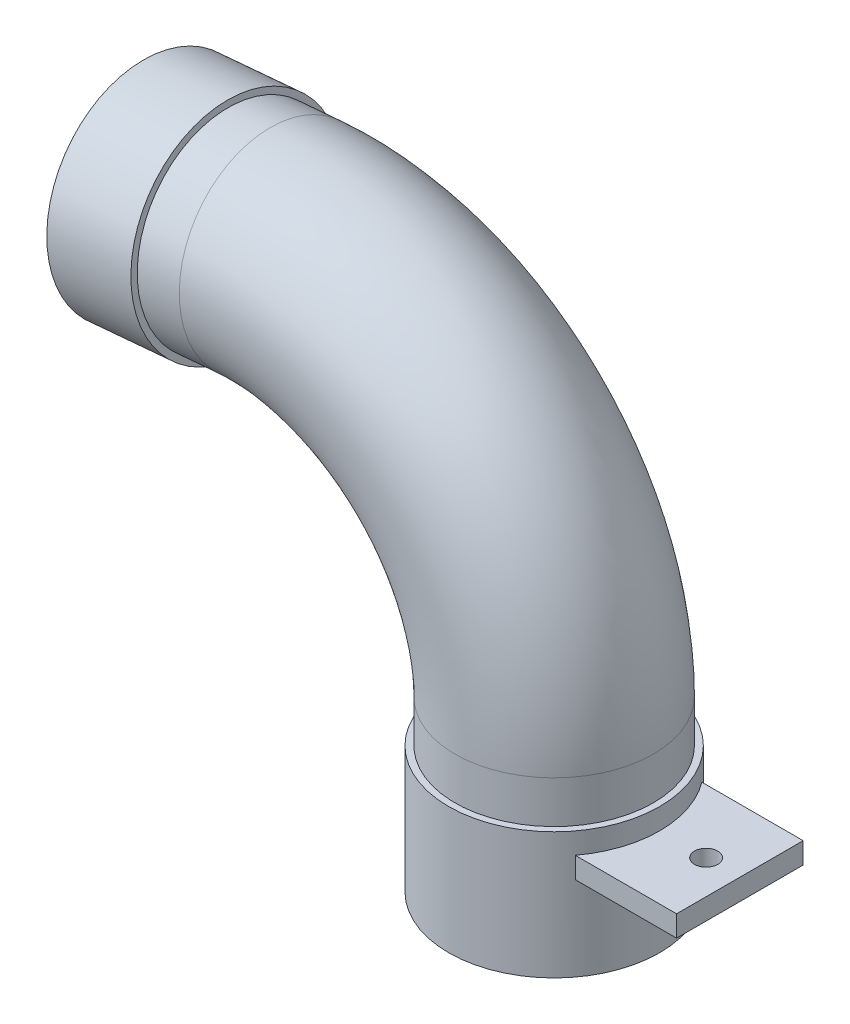
ISO-10303-21;
HEADER;
FILE_DESCRIPTION(('STEP AP214'),'2;1');
FILE_NAME('part.step','',(''),(''),'','','');
FILE_SCHEMA(('AUTOMOTIVE_DESIGN { 1 0 10303 214 1 1 1 1 }'));
ENDSEC;
DATA;
#1=APPLICATION_CONTEXT('core data for automotive mechanical design processes');
#2=APPLICATION_PROTOCOL_DEFINITION('international standard','automotive_design',2000,#1);
#3=PRODUCT_CONTEXT('',#1,'mechanical');
#4=PRODUCT('Part','Part','',(#3));
#5=PRODUCT_RELATED_PRODUCT_CATEGORY('part','',(#4));
#6=PRODUCT_DEFINITION_FORMATION('','',#4);
#7=PRODUCT_DEFINITION_CONTEXT('part definition',#1,'design');
#8=PRODUCT_DEFINITION('design','',#6,#7);
#9=PRODUCT_DEFINITION_SHAPE('','',#8);
#10=(LENGTH_UNIT() NAMED_UNIT(*) SI_UNIT(.MILLI.,.METRE.));
#11=(NAMED_UNIT(*) PLANE_ANGLE_UNIT() SI_UNIT($,.RADIAN.));
#12=(NAMED_UNIT(*) SI_UNIT($,.STERADIAN.) SOLID_ANGLE_UNIT());
#13=UNCERTAINTY_MEASURE_WITH_UNIT(LENGTH_MEASURE(1.E-05),#10,'distance_accuracy_value','');
#14=(GEOMETRIC_REPRESENTATION_CONTEXT(3) GLOBAL_UNCERTAINTY_ASSIGNED_CONTEXT((#13)) GLOBAL_UNIT_ASSIGNED_CONTEXT((#10,
#11,#12)) REPRESENTATION_CONTEXT('',''));
#15=CARTESIAN_POINT('',(0.,0.,0.));
#16=DIRECTION('',(0.,0.,1.));
#17=DIRECTION('',(1.,0.,0.));
#18=AXIS2_PLACEMENT_3D('',#15,#16,#17);
#19=CARTESIAN_POINT('',(0.,10.,0.));
#20=DIRECTION('',(0.,-1.,0.));
#21=DIRECTION('',(0.,0.,-1.));
#22=AXIS2_PLACEMENT_3D('',#19,#20,#21);
#23=CYLINDRICAL_SURFACE('',#22,23.);
#24=CARTESIAN_POINT('',(0.,-20.,0.));
#25=DIRECTION('',(0.,-1.,0.));
#26=DIRECTION('',(0.,0.,-1.));
#27=AXIS2_PLACEMENT_3D('',#24,#25,#26);
#28=CIRCLE('',#27,23.);
#29=CARTESIAN_POINT('',(0.,-20.,-23.));
#30=VERTEX_POINT('',#29);
#31=EDGE_CURVE('E129',#30,#30,#28,.T.);
#32=ORIENTED_EDGE('',*,*,#31,.T.);
#33=EDGE_LOOP('',(#32));
#34=FACE_BOUND('',#33,.T.);
#35=CARTESIAN_POINT('',(0.,0.,0.));
#36=DIRECTION('',(0.,1.,0.));
#37=DIRECTION('',(0.,0.,1.));
#38=AXIS2_PLACEMENT_3D('',#35,#36,#37);
#39=CIRCLE('',#38,23.);
#40=CARTESIAN_POINT('',(0.,0.,23.));
#41=VERTEX_POINT('',#40);
#42=EDGE_CURVE('E11',#41,#41,#39,.F.);
#43=ORIENTED_EDGE('',*,*,#42,.F.);
#44=EDGE_LOOP('',(#43));
#45=FACE_BOUND('',#44,.T.);
#46=ADVANCED_FACE('F39',(#34,#45),#23,.F.);
#47=CARTESIAN_POINT('',(0.,10.,0.));
#48=DIRECTION('',(0.,-1.,0.));
#49=DIRECTION('',(0.,0.,-1.));
#50=AXIS2_PLACEMENT_3D('',#47,#48,#49);
#51=CYLINDRICAL_SURFACE('',#50,25.);
#52=CARTESIAN_POINT('',(0.,10.,0.));
#53=DIRECTION('',(0.,-1.,0.));
#54=DIRECTION('',(0.,0.,-1.));
#55=AXIS2_PLACEMENT_3D('',#52,#53,#54);
#56=CIRCLE('',#55,25.);
#57=CARTESIAN_POINT('',(0.,10.,-25.));
#58=VERTEX_POINT('',#57);
#59=EDGE_CURVE('E49',#58,#58,#56,.T.);
#60=ORIENTED_EDGE('',*,*,#59,.T.);
#61=EDGE_LOOP('',(#60));
#62=FACE_BOUND('',#61,.T.);
#63=CARTESIAN_POINT('',(0.,-20.,0.));
#64=DIRECTION('',(0.,-1.,0.));
#65=DIRECTION('',(0.,0.,-1.));
#66=AXIS2_PLACEMENT_3D('',#63,#64,#65);
#67=CIRCLE('',#66,25.);
#68=CARTESIAN_POINT('',(0.,-20.,-25.));
#69=VERTEX_POINT('',#68);
#70=EDGE_CURVE('E138',#69,#69,#67,.T.);
#71=ORIENTED_EDGE('',*,*,#70,.F.);
#72=EDGE_LOOP('',(#71));
#73=FACE_BOUND('',#72,.T.);
#74=DIRECTION('',(0.,-1.,0.));
#75=VECTOR('',#74,1.);
#76=CARTESIAN_POINT('',(20.,5.,15.));
#77=LINE('',#76,#75);
#78=CARTESIAN_POINT('',(20.,5.,15.));
#79=VERTEX_POINT('',#78);
#80=CARTESIAN_POINT('',(20.,0.,15.));
#81=VERTEX_POINT('',#80);
#82=EDGE_CURVE('E61',#79,#81,#77,.T.);
#83=ORIENTED_EDGE('',*,*,#82,.F.);
#84=CARTESIAN_POINT('',(0.,5.,0.));
#85=DIRECTION('',(0.,1.,0.));
#86=DIRECTION('',(0.,0.,-1.));
#87=AXIS2_PLACEMENT_3D('',#84,#85,#86);
#88=CIRCLE('',#87,25.);
#89=CARTESIAN_POINT('',(20.,5.,-15.));
#90=VERTEX_POINT('',#89);
#91=EDGE_CURVE('E56',#79,#90,#88,.T.);
#92=ORIENTED_EDGE('',*,*,#91,.T.);
#93=DIRECTION('',(0.,-1.,0.));
#94=VECTOR('',#93,1.);
#95=CARTESIAN_POINT('',(20.,5.,-15.));
#96=LINE('',#95,#94);
#97=CARTESIAN_POINT('',(20.,0.,-15.));
#98=VERTEX_POINT('',#97);
#99=EDGE_CURVE('E130',#90,#98,#96,.T.);
#100=ORIENTED_EDGE('',*,*,#99,.T.);
#101=CARTESIAN_POINT('',(0.,0.,0.));
#102=DIRECTION('',(0.,1.,0.));
#103=DIRECTION('',(0.,0.,-1.));
#104=AXIS2_PLACEMENT_3D('',#101,#102,#103);
#105=CIRCLE('',#104,25.);
#106=EDGE_CURVE('E108',#81,#98,#105,.T.);
#107=ORIENTED_EDGE('',*,*,#106,.F.);
#108=EDGE_LOOP('',(#83,#92,#100,#107));
#109=FACE_BOUND('',#108,.T.);
#110=ADVANCED_FACE('F41',(#62,#73,#109),#51,.T.);
#111=CARTESIAN_POINT('',(0.,10.,0.));
#112=DIRECTION('',(0.,-1.,0.));
#113=DIRECTION('',(0.,0.,-1.));
#114=AXIS2_PLACEMENT_3D('',#111,#112,#113);
#115=PLANE('',#114);
#116=CARTESIAN_POINT('',(0.,10.,0.));
#117=DIRECTION('',(0.,-1.,0.));
#118=DIRECTION('',(0.,0.,-1.));
#119=AXIS2_PLACEMENT_3D('',#116,#117,#118);
#120=CIRCLE('',#119,23.5);
#121=CARTESIAN_POINT('',(0.,10.,-23.5));
#122=VERTEX_POINT('',#121);
#123=EDGE_CURVE('E43',#122,#122,#120,.T.);
#124=ORIENTED_EDGE('',*,*,#123,.T.);
#125=EDGE_LOOP('',(#124));
#126=FACE_BOUND('',#125,.T.);
#127=ORIENTED_EDGE('',*,*,#59,.F.);
#128=EDGE_LOOP('',(#127));
#129=FACE_BOUND('',#128,.T.);
#130=ADVANCED_FACE('F148',(#126,#129),#115,.F.);
#131=CARTESIAN_POINT('',(0.,-20.,0.));
#132=DIRECTION('',(0.,-1.,0.));
#133=DIRECTION('',(0.,0.,-1.));
#134=AXIS2_PLACEMENT_3D('',#131,#132,#133);
#135=PLANE('',#134);
#136=ORIENTED_EDGE('',*,*,#70,.T.);
#137=EDGE_LOOP('',(#136));
#138=FACE_BOUND('',#137,.T.);
#139=ORIENTED_EDGE('',*,*,#31,.F.);
#140=EDGE_LOOP('',(#139));
#141=FACE_BOUND('',#140,.T.);
#142=ADVANCED_FACE('F150',(#138,#141),#135,.T.);
#143=CARTESIAN_POINT('',(44.,5.,15.));
#144=DIRECTION('',(1.,0.,0.));
#145=DIRECTION('',(0.,0.,-1.));
#146=AXIS2_PLACEMENT_3D('',#143,#144,#145);
#147=PLANE('',#146);
#148=DIRECTION('',(0.,0.,1.));
#149=VECTOR('',#148,1.);
#150=CARTESIAN_POINT('',(44.,0.,15.));
#151=LINE('',#150,#149);
#152=CARTESIAN_POINT('',(44.,0.,-15.));
#153=VERTEX_POINT('',#152);
#154=CARTESIAN_POINT('',(44.,0.,15.));
#155=VERTEX_POINT('',#154);
#156=EDGE_CURVE('E118',#153,#155,#151,.T.);
#157=ORIENTED_EDGE('',*,*,#156,.F.);
#158=DIRECTION('',(0.,-1.,0.));
#159=VECTOR('',#158,1.);
#160=CARTESIAN_POINT('',(44.,5.,-15.));
#161=LINE('',#160,#159);
#162=CARTESIAN_POINT('',(44.,5.,-15.));
#163=VERTEX_POINT('',#162);
#164=EDGE_CURVE('E102',#163,#153,#161,.T.);
#165=ORIENTED_EDGE('',*,*,#164,.F.);
#166=DIRECTION('',(0.,0.,1.));
#167=VECTOR('',#166,1.);
#168=CARTESIAN_POINT('',(44.,5.,15.));
#169=LINE('',#168,#167);
#170=CARTESIAN_POINT('',(44.,5.,15.));
#171=VERTEX_POINT('',#170);
#172=EDGE_CURVE('E97',#163,#171,#169,.T.);
#173=ORIENTED_EDGE('',*,*,#172,.T.);
#174=DIRECTION('',(0.,-1.,0.));
#175=VECTOR('',#174,1.);
#176=CARTESIAN_POINT('',(44.,5.,15.));
#177=LINE('',#176,#175);
#178=EDGE_CURVE('E80',#171,#155,#177,.T.);
#179=ORIENTED_EDGE('',*,*,#178,.T.);
#180=EDGE_LOOP('',(#157,#165,#173,#179));
#181=FACE_BOUND('',#180,.T.);
#182=ADVANCED_FACE('F101',(#181),#147,.T.);
#183=CARTESIAN_POINT('',(44.,5.,-15.));
#184=DIRECTION('',(0.,0.,-1.));
#185=DIRECTION('',(-1.,0.,0.));
#186=AXIS2_PLACEMENT_3D('',#183,#184,#185);
#187=PLANE('',#186);
#188=DIRECTION('',(1.,0.,0.));
#189=VECTOR('',#188,1.);
#190=CARTESIAN_POINT('',(44.,0.,-15.));
#191=LINE('',#190,#189);
#192=EDGE_CURVE('E104',#98,#153,#191,.T.);
#193=ORIENTED_EDGE('',*,*,#192,.F.);
#194=ORIENTED_EDGE('',*,*,#99,.F.);
#195=DIRECTION('',(1.,0.,0.));
#196=VECTOR('',#195,1.);
#197=CARTESIAN_POINT('',(44.,5.,-15.));
#198=LINE('',#197,#196);
#199=EDGE_CURVE('E91',#90,#163,#198,.T.);
#200=ORIENTED_EDGE('',*,*,#199,.T.);
#201=ORIENTED_EDGE('',*,*,#164,.T.);
#202=EDGE_LOOP('',(#193,#194,#200,#201));
#203=FACE_BOUND('',#202,.T.);
#204=ADVANCED_FACE('F168',(#203),#187,.T.);
#205=CARTESIAN_POINT('',(20.,5.,15.));
#206=DIRECTION('',(0.,0.,1.));
#207=DIRECTION('',(1.,0.,0.));
#208=AXIS2_PLACEMENT_3D('',#205,#206,#207);
#209=PLANE('',#208);
#210=DIRECTION('',(-1.,0.,0.));
#211=VECTOR('',#210,1.);
#212=CARTESIAN_POINT('',(20.,0.,15.));
#213=LINE('',#212,#211);
#214=EDGE_CURVE('E85',#155,#81,#213,.T.);
#215=ORIENTED_EDGE('',*,*,#214,.F.);
#216=ORIENTED_EDGE('',*,*,#178,.F.);
#217=DIRECTION('',(-1.,0.,0.));
#218=VECTOR('',#217,1.);
#219=CARTESIAN_POINT('',(20.,5.,15.));
#220=LINE('',#219,#218);
#221=EDGE_CURVE('E83',#171,#79,#220,.T.);
#222=ORIENTED_EDGE('',*,*,#221,.T.);
#223=ORIENTED_EDGE('',*,*,#82,.T.);
#224=EDGE_LOOP('',(#215,#216,#222,#223));
#225=FACE_BOUND('',#224,.T.);
#226=ADVANCED_FACE('F82',(#225),#209,.T.);
#227=CARTESIAN_POINT('',(0.,5.,0.));
#228=DIRECTION('',(0.,-1.,0.));
#229=DIRECTION('',(0.,0.,-1.));
#230=AXIS2_PLACEMENT_3D('',#227,#228,#229);
#231=PLANE('',#230);
#232=CARTESIAN_POINT('',(36.,5.,0.));
#233=DIRECTION('',(0.,-1.,0.));
#234=DIRECTION('',(0.,0.,-1.));
#235=AXIS2_PLACEMENT_3D('',#232,#233,#234);
#236=CIRCLE('',#235,2.75);
#237=CARTESIAN_POINT('',(36.,5.,-2.75));
#238=VERTEX_POINT('',#237);
#239=EDGE_CURVE('E121',#238,#238,#236,.T.);
#240=ORIENTED_EDGE('',*,*,#239,.T.);
#241=EDGE_LOOP('',(#240));
#242=FACE_BOUND('',#241,.T.);
#243=ORIENTED_EDGE('',*,*,#172,.F.);
#244=ORIENTED_EDGE('',*,*,#199,.F.);
#245=ORIENTED_EDGE('',*,*,#91,.F.);
#246=ORIENTED_EDGE('',*,*,#221,.F.);
#247=EDGE_LOOP('',(#243,#244,#245,#246));
#248=FACE_BOUND('',#247,.T.);
#249=ADVANCED_FACE('F95',(#242,#248),#231,.F.);
#250=CARTESIAN_POINT('',(0.,0.,0.));
#251=DIRECTION('',(0.,-1.,0.));
#252=DIRECTION('',(0.,0.,-1.));
#253=AXIS2_PLACEMENT_3D('',#250,#251,#252);
#254=PLANE('',#253);
#255=CARTESIAN_POINT('',(36.,0.,0.));
#256=DIRECTION('',(0.,-1.,0.));
#257=DIRECTION('',(0.,0.,-1.));
#258=AXIS2_PLACEMENT_3D('',#255,#256,#257);
#259=CIRCLE('',#258,2.75);
#260=CARTESIAN_POINT('',(36.,0.,-2.75));
#261=VERTEX_POINT('',#260);
#262=EDGE_CURVE('E111',#261,#261,#259,.T.);
#263=ORIENTED_EDGE('',*,*,#262,.F.);
#264=EDGE_LOOP('',(#263));
#265=FACE_BOUND('',#264,.T.);
#266=ORIENTED_EDGE('',*,*,#156,.T.);
#267=ORIENTED_EDGE('',*,*,#214,.T.);
#268=ORIENTED_EDGE('',*,*,#106,.T.);
#269=ORIENTED_EDGE('',*,*,#192,.T.);
#270=EDGE_LOOP('',(#266,#267,#268,#269));
#271=FACE_BOUND('',#270,.T.);
#272=ADVANCED_FACE('F174',(#265,#271),#254,.T.);
#273=CARTESIAN_POINT('',(36.,5.,0.));
#274=DIRECTION('',(0.,-1.,0.));
#275=DIRECTION('',(0.,0.,-1.));
#276=AXIS2_PLACEMENT_3D('',#273,#274,#275);
#277=CYLINDRICAL_SURFACE('',#276,2.75);
#278=ORIENTED_EDGE('',*,*,#239,.F.);
#279=EDGE_LOOP('',(#278));
#280=FACE_BOUND('',#279,.T.);
#281=ORIENTED_EDGE('',*,*,#262,.T.);
#282=EDGE_LOOP('',(#281));
#283=FACE_BOUND('',#282,.T.);
#284=ADVANCED_FACE('F177',(#280,#283),#277,.F.);
#285=CARTESIAN_POINT('',(0.,0.,0.));
#286=DIRECTION('',(0.,1.,0.));
#287=DIRECTION('',(0.,0.,1.));
#288=AXIS2_PLACEMENT_3D('',#285,#286,#287);
#289=CYLINDRICAL_SURFACE('',#288,23.5);
#290=CARTESIAN_POINT('',(0.,20.,0.));
#291=DIRECTION('',(0.,1.,0.));
#292=DIRECTION('',(0.,0.,1.));
#293=AXIS2_PLACEMENT_3D('',#290,#291,#292);
#294=CIRCLE('',#293,23.5);
#295=CARTESIAN_POINT('',(23.5,20.,0.));
#296=VERTEX_POINT('',#295);
#297=EDGE_CURVE('E269',#296,#296,#294,.T.);
#298=ORIENTED_EDGE('',*,*,#297,.F.);
#299=EDGE_LOOP('',(#298));
#300=FACE_BOUND('',#299,.T.);
#301=ORIENTED_EDGE('',*,*,#123,.F.);
#302=EDGE_LOOP('',(#301));
#303=FACE_BOUND('',#302,.T.);
#304=ADVANCED_FACE('F184',(#300,#303),#289,.T.);
#305=CARTESIAN_POINT('',(0.,0.,0.));
#306=DIRECTION('',(0.,1.,0.));
#307=DIRECTION('',(0.,0.,1.));
#308=AXIS2_PLACEMENT_3D('',#305,#306,#307);
#309=PLANE('',#308);
#310=CARTESIAN_POINT('',(0.,0.,0.));
#311=DIRECTION('',(0.,1.,0.));
#312=DIRECTION('',(0.,0.,1.));
#313=AXIS2_PLACEMENT_3D('',#310,#311,#312);
#314=CIRCLE('',#313,22.);
#315=CARTESIAN_POINT('',(0.,0.,22.));
#316=VERTEX_POINT('',#315);
#317=EDGE_CURVE('E252',#316,#316,#314,.F.);
#318=ORIENTED_EDGE('',*,*,#317,.F.);
#319=EDGE_LOOP('',(#318));
#320=FACE_BOUND('',#319,.T.);
#321=ORIENTED_EDGE('',*,*,#42,.T.);
#322=EDGE_LOOP('',(#321));
#323=FACE_BOUND('',#322,.T.);
#324=ADVANCED_FACE('F190',(#320,#323),#309,.F.);
#325=CARTESIAN_POINT('',(-65.2293445648595,79.7716818855047,0.));
#326=DIRECTION('',(-0.996194698091746,-0.087155742747657,0.));
#327=DIRECTION('',(0.087155742747657,-0.996194698091746,0.));
#328=AXIS2_PLACEMENT_3D('',#325,#326,#327);
#329=CYLINDRICAL_SURFACE('',#328,23.5);
#330=CARTESIAN_POINT('',(-65.2293445648595,79.7716818855047,0.));
#331=DIRECTION('',(-0.996194698091746,-0.0871557427476579,0.));
#332=DIRECTION('',(0.,0.,1.));
#333=AXIS2_PLACEMENT_3D('',#330,#331,#332);
#334=CIRCLE('',#333,23.5);
#335=CARTESIAN_POINT('',(-67.2775045194294,103.182257290661,0.));
#336=VERTEX_POINT('',#335);
#337=EDGE_CURVE('E257',#336,#336,#334,.T.);
#338=ORIENTED_EDGE('',*,*,#337,.T.);
#339=EDGE_LOOP('',(#338));
#340=FACE_BOUND('',#339,.T.);
#341=CARTESIAN_POINT('',(-75.1912915457762,78.9001244580282,0.));
#342=DIRECTION('',(-0.996194698091746,-0.087155742747648,0.));
#343=DIRECTION('',(0.087155742747648,-0.996194698091746,0.));
#344=AXIS2_PLACEMENT_3D('',#341,#342,#343);
#345=CIRCLE('',#344,23.5);
#346=CARTESIAN_POINT('',(-73.1431315912064,55.4895490528722,0.));
#347=VERTEX_POINT('',#346);
#348=EDGE_CURVE('E273',#347,#347,#345,.F.);
#349=ORIENTED_EDGE('',*,*,#348,.T.);
#350=EDGE_LOOP('',(#349));
#351=FACE_BOUND('',#350,.T.);
#352=ADVANCED_FACE('F186',(#340,#351),#329,.T.);
#353=CARTESIAN_POINT('',(-85.1532385266944,78.0285670305516,0.));
#354=DIRECTION('',(-0.996194698091746,-0.087155742747657,0.));
#355=DIRECTION('',(0.,0.,1.));
#356=AXIS2_PLACEMENT_3D('',#353,#354,#355);
#357=PLANE('',#356);
#358=CARTESIAN_POINT('',(-85.1532385266944,78.0285670305516,0.));
#359=DIRECTION('',(-0.996194698091746,-0.087155742747657,0.));
#360=DIRECTION('',(0.,0.,1.));
#361=AXIS2_PLACEMENT_3D('',#358,#359,#360);
#362=CIRCLE('',#361,22.);
#363=CARTESIAN_POINT('',(-85.1532385266944,78.0285670305516,22.));
#364=VERTEX_POINT('',#363);
#365=EDGE_CURVE('E265',#364,#364,#362,.F.);
#366=ORIENTED_EDGE('',*,*,#365,.T.);
#367=EDGE_LOOP('',(#366));
#368=FACE_BOUND('',#367,.T.);
#369=CARTESIAN_POINT('',(-85.1532385266944,78.0285670305518,0.));
#370=DIRECTION('',(-0.996194698091746,-0.087155742747657,0.));
#371=DIRECTION('',(0.087155742747657,-0.996194698091746,0.));
#372=AXIS2_PLACEMENT_3D('',#369,#370,#371);
#373=CIRCLE('',#372,23.);
#374=CARTESIAN_POINT('',(-83.1486564434983,55.1160889744416,0.));
#375=VERTEX_POINT('',#374);
#376=EDGE_CURVE('E251',#375,#375,#373,.T.);
#377=ORIENTED_EDGE('',*,*,#376,.T.);
#378=EDGE_LOOP('',(#377));
#379=FACE_BOUND('',#378,.T.);
#380=ADVANCED_FACE('F189',(#368,#379),#357,.T.);
#381=CARTESIAN_POINT('',(-60.,20.,0.));
#382=DIRECTION('',(0.,0.,1.));
#383=DIRECTION('',(1.,0.,0.));
#384=AXIS2_PLACEMENT_3D('',#381,#382,#383);
#385=TOROIDAL_SURFACE('',#384,60.,23.5);
#386=CARTESIAN_POINT('',(-60.,20.,0.));
#387=DIRECTION('',(0.,0.,1.));
#388=DIRECTION('',(1.,0.,0.));
#389=AXIS2_PLACEMENT_3D('',#386,#387,#388);
#390=CIRCLE('',#389,83.5);
#391=EDGE_CURVE('',#296,#336,#390,.T.);
#392=ORIENTED_EDGE('',*,*,#297,.T.);
#393=ORIENTED_EDGE('',*,*,#337,.F.);
#394=ORIENTED_EDGE('',*,*,#391,.T.);
#395=ORIENTED_EDGE('',*,*,#391,.F.);
#396=EDGE_LOOP('',(#392,#394,#393,#395));
#397=FACE_BOUND('',#396,.T.);
#398=ADVANCED_FACE('F192',(#397),#385,.T.);
#399=CARTESIAN_POINT('',(0.,0.,0.));
#400=DIRECTION('',(0.,1.,0.));
#401=DIRECTION('',(0.,0.,1.));
#402=AXIS2_PLACEMENT_3D('',#399,#400,#401);
#403=CYLINDRICAL_SURFACE('',#402,22.);
#404=CARTESIAN_POINT('',(0.,20.,0.));
#405=DIRECTION('',(0.,1.,0.));
#406=DIRECTION('',(0.,0.,1.));
#407=AXIS2_PLACEMENT_3D('',#404,#405,#406);
#408=CIRCLE('',#407,22.);
#409=CARTESIAN_POINT('',(22.,20.,0.));
#410=VERTEX_POINT('',#409);
#411=EDGE_CURVE('E256',#410,#410,#408,.F.);
#412=ORIENTED_EDGE('',*,*,#411,.F.);
#413=EDGE_LOOP('',(#412));
#414=FACE_BOUND('',#413,.T.);
#415=ORIENTED_EDGE('',*,*,#317,.T.);
#416=EDGE_LOOP('',(#415));
#417=FACE_BOUND('',#416,.T.);
#418=ADVANCED_FACE('F195',(#414,#417),#403,.F.);
#419=CARTESIAN_POINT('',(-60.,20.,0.));
#420=DIRECTION('',(0.,0.,1.));
#421=DIRECTION('',(1.,0.,0.));
#422=AXIS2_PLACEMENT_3D('',#419,#420,#421);
#423=TOROIDAL_SURFACE('',#422,60.,22.);
#424=CARTESIAN_POINT('',(-65.2293445648595,79.7716818855047,0.));
#425=DIRECTION('',(-0.996194698091746,-0.0871557427476579,0.));
#426=DIRECTION('',(0.,0.,1.));
#427=AXIS2_PLACEMENT_3D('',#424,#425,#426);
#428=CIRCLE('',#427,22.);
#429=CARTESIAN_POINT('',(-67.1467709053079,101.687965243523,0.));
#430=VERTEX_POINT('',#429);
#431=EDGE_CURVE('E261',#430,#430,#428,.F.);
#432=CARTESIAN_POINT('',(-60.,20.,0.));
#433=DIRECTION('',(0.,0.,1.));
#434=DIRECTION('',(1.,0.,0.));
#435=AXIS2_PLACEMENT_3D('',#432,#433,#434);
#436=CIRCLE('',#435,82.);
#437=EDGE_CURVE('',#410,#430,#436,.T.);
#438=ORIENTED_EDGE('',*,*,#411,.T.);
#439=ORIENTED_EDGE('',*,*,#431,.F.);
#440=ORIENTED_EDGE('',*,*,#437,.T.);
#441=ORIENTED_EDGE('',*,*,#437,.F.);
#442=EDGE_LOOP('',(#438,#440,#439,#441));
#443=FACE_BOUND('',#442,.T.);
#444=ADVANCED_FACE('F210',(#443),#423,.F.);
#445=CARTESIAN_POINT('',(-65.2293445648595,79.7716818855047,0.));
#446=DIRECTION('',(-0.996194698091746,-0.087155742747657,0.));
#447=DIRECTION('',(0.087155742747657,-0.996194698091746,0.));
#448=AXIS2_PLACEMENT_3D('',#445,#446,#447);
#449=CYLINDRICAL_SURFACE('',#448,22.);
#450=ORIENTED_EDGE('',*,*,#365,.F.);
#451=EDGE_LOOP('',(#450));
#452=FACE_BOUND('',#451,.T.);
#453=ORIENTED_EDGE('',*,*,#431,.T.);
#454=EDGE_LOOP('',(#453));
#455=FACE_BOUND('',#454,.T.);
#456=ADVANCED_FACE('F207',(#452,#455),#449,.F.);
#457=CARTESIAN_POINT('',(-75.1912915457762,78.9001244580283,0.));
#458=DIRECTION('',(-0.996194698091746,-0.087155742747648,0.));
#459=DIRECTION('',(0.087155742747648,-0.996194698091746,0.));
#460=AXIS2_PLACEMENT_3D('',#457,#458,#459);
#461=CYLINDRICAL_SURFACE('',#460,25.);
#462=CARTESIAN_POINT('',(-75.1912915457762,78.9001244580283,0.));
#463=DIRECTION('',(-0.996194698091746,-0.087155742747648,0.));
#464=DIRECTION('',(0.087155742747648,-0.996194698091746,0.));
#465=AXIS2_PLACEMENT_3D('',#462,#463,#464);
#466=CIRCLE('',#465,25.);
#467=CARTESIAN_POINT('',(-73.012397977085,53.9952570057346,0.));
#468=VERTEX_POINT('',#467);
#469=EDGE_CURVE('E245',#468,#468,#466,.T.);
#470=ORIENTED_EDGE('',*,*,#469,.T.);
#471=EDGE_LOOP('',(#470));
#472=FACE_BOUND('',#471,.T.);
#473=CARTESIAN_POINT('',(-95.1151855076111,77.1570096030753,0.));
#474=DIRECTION('',(-0.996194698091746,-0.087155742747648,0.));
#475=DIRECTION('',(0.087155742747648,-0.996194698091746,0.));
#476=AXIS2_PLACEMENT_3D('',#473,#474,#475);
#477=CIRCLE('',#476,25.);
#478=CARTESIAN_POINT('',(-92.9362919389199,52.2521421507817,0.));
#479=VERTEX_POINT('',#478);
#480=EDGE_CURVE('E237',#479,#479,#477,.T.);
#481=ORIENTED_EDGE('',*,*,#480,.F.);
#482=EDGE_LOOP('',(#481));
#483=FACE_BOUND('',#482,.T.);
#484=ADVANCED_FACE('F197',(#472,#483),#461,.T.);
#485=CARTESIAN_POINT('',(-75.1912915457762,78.9001244580283,0.));
#486=DIRECTION('',(-0.996194698091746,-0.087155742747648,0.));
#487=DIRECTION('',(0.087155742747648,-0.996194698091746,0.));
#488=AXIS2_PLACEMENT_3D('',#485,#486,#487);
#489=PLANE('',#488);
#490=ORIENTED_EDGE('',*,*,#348,.F.);
#491=EDGE_LOOP('',(#490));
#492=FACE_BOUND('',#491,.T.);
#493=ORIENTED_EDGE('',*,*,#469,.F.);
#494=EDGE_LOOP('',(#493));
#495=FACE_BOUND('',#494,.T.);
#496=ADVANCED_FACE('F220',(#492,#495),#489,.F.);
#497=CARTESIAN_POINT('',(-75.1912915457762,78.9001244580283,0.));
#498=DIRECTION('',(-0.996194698091746,-0.087155742747648,0.));
#499=DIRECTION('',(0.087155742747648,-0.996194698091746,0.));
#500=AXIS2_PLACEMENT_3D('',#497,#498,#499);
#501=CYLINDRICAL_SURFACE('',#500,23.);
#502=ORIENTED_EDGE('',*,*,#376,.F.);
#503=EDGE_LOOP('',(#502));
#504=FACE_BOUND('',#503,.T.);
#505=CARTESIAN_POINT('',(-95.1151855076111,77.1570096030753,0.));
#506=DIRECTION('',(-0.996194698091746,-0.087155742747648,0.));
#507=DIRECTION('',(0.087155742747648,-0.996194698091746,0.));
#508=AXIS2_PLACEMENT_3D('',#505,#506,#507);
#509=CIRCLE('',#508,23.);
#510=CARTESIAN_POINT('',(-93.1106034244152,54.2445315469652,0.));
#511=VERTEX_POINT('',#510);
#512=EDGE_CURVE('E240',#511,#511,#509,.T.);
#513=ORIENTED_EDGE('',*,*,#512,.T.);
#514=EDGE_LOOP('',(#513));
#515=FACE_BOUND('',#514,.T.);
#516=ADVANCED_FACE('F224',(#504,#515),#501,.F.);
#517=CARTESIAN_POINT('',(-95.1151855076111,77.1570096030753,0.));
#518=DIRECTION('',(-0.996194698091746,-0.087155742747648,0.));
#519=DIRECTION('',(0.087155742747648,-0.996194698091746,0.));
#520=AXIS2_PLACEMENT_3D('',#517,#518,#519);
#521=PLANE('',#520);
#522=ORIENTED_EDGE('',*,*,#480,.T.);
#523=EDGE_LOOP('',(#522));
#524=FACE_BOUND('',#523,.T.);
#525=ORIENTED_EDGE('',*,*,#512,.F.);
#526=EDGE_LOOP('',(#525));
#527=FACE_BOUND('',#526,.T.);
#528=ADVANCED_FACE('F228',(#524,#527),#521,.T.);
#529=CLOSED_SHELL('',(#46,#110,#130,#142,#182,#204,#226,#249,#272,#284,#304,#324,#352,#380,#398,
#418,#444,#456,#484,#496,#516,#528));
#530=MANIFOLD_SOLID_BREP('B2',#529);
#531=ADVANCED_BREP_SHAPE_REPRESENTATION('',(#18,#530),#14);
#532=SHAPE_DEFINITION_REPRESENTATION(#9,#531);
ENDSEC;
END-ISO-10303-21;
